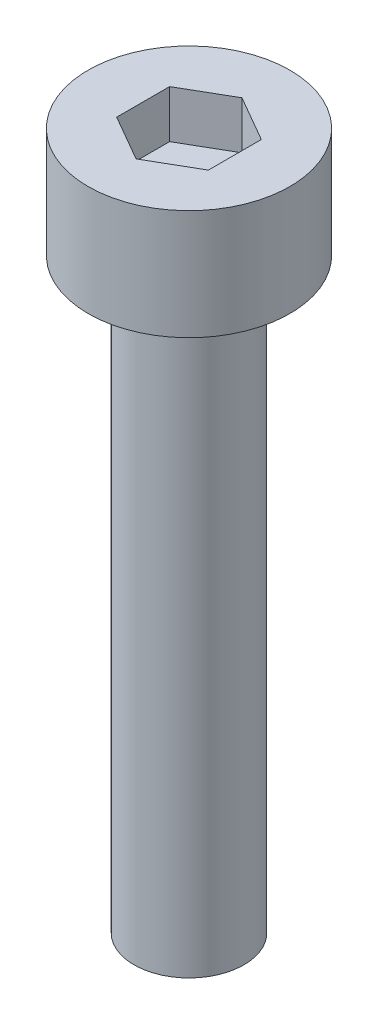
ISO-10303-21;
HEADER;
FILE_DESCRIPTION(('STEP AP214'),'2;1');
FILE_NAME('part.step','',(''),(''),'','','');
FILE_SCHEMA(('AUTOMOTIVE_DESIGN { 1 0 10303 214 1 1 1 1 }'));
ENDSEC;
DATA;
#1=APPLICATION_CONTEXT('core data for automotive mechanical design processes');
#2=APPLICATION_PROTOCOL_DEFINITION('international standard','automotive_design',2000,#1);
#3=PRODUCT_CONTEXT('',#1,'mechanical');
#4=PRODUCT('Part','Part','',(#3));
#5=PRODUCT_RELATED_PRODUCT_CATEGORY('part','',(#4));
#6=PRODUCT_DEFINITION_FORMATION('','',#4);
#7=PRODUCT_DEFINITION_CONTEXT('part definition',#1,'design');
#8=PRODUCT_DEFINITION('design','',#6,#7);
#9=PRODUCT_DEFINITION_SHAPE('','',#8);
#10=(LENGTH_UNIT() NAMED_UNIT(*) SI_UNIT(.MILLI.,.METRE.));
#11=(NAMED_UNIT(*) PLANE_ANGLE_UNIT() SI_UNIT($,.RADIAN.));
#12=(NAMED_UNIT(*) SI_UNIT($,.STERADIAN.) SOLID_ANGLE_UNIT());
#13=UNCERTAINTY_MEASURE_WITH_UNIT(LENGTH_MEASURE(1.E-05),#10,'distance_accuracy_value','');
#14=(GEOMETRIC_REPRESENTATION_CONTEXT(3) GLOBAL_UNCERTAINTY_ASSIGNED_CONTEXT((#13)) GLOBAL_UNIT_ASSIGNED_CONTEXT((#10,
#11,#12)) REPRESENTATION_CONTEXT('',''));
#15=CARTESIAN_POINT('',(0.,0.,0.));
#16=DIRECTION('',(0.,0.,1.));
#17=DIRECTION('',(1.,0.,0.));
#18=AXIS2_PLACEMENT_3D('',#15,#16,#17);
#19=CARTESIAN_POINT('',(0.,3.,0.));
#20=DIRECTION('',(0.,-1.,0.));
#21=DIRECTION('',(0.,0.,-1.));
#22=AXIS2_PLACEMENT_3D('',#19,#20,#21);
#23=CYLINDRICAL_SURFACE('',#22,2.75);
#24=CARTESIAN_POINT('',(0.,3.,0.));
#25=DIRECTION('',(0.,1.,0.));
#26=DIRECTION('',(0.,0.,1.));
#27=AXIS2_PLACEMENT_3D('',#24,#25,#26);
#28=CIRCLE('',#27,2.75);
#29=CARTESIAN_POINT('',(0.,3.,2.75));
#30=VERTEX_POINT('',#29);
#31=EDGE_CURVE('E44',#30,#30,#28,.T.);
#32=ORIENTED_EDGE('',*,*,#31,.F.);
#33=EDGE_LOOP('',(#32));
#34=FACE_BOUND('',#33,.T.);
#35=CARTESIAN_POINT('',(0.,0.,0.));
#36=DIRECTION('',(0.,1.,0.));
#37=DIRECTION('',(0.,0.,1.));
#38=AXIS2_PLACEMENT_3D('',#35,#36,#37);
#39=CIRCLE('',#38,2.75);
#40=CARTESIAN_POINT('',(0.,0.,2.75));
#41=VERTEX_POINT('',#40);
#42=EDGE_CURVE('E39',#41,#41,#39,.T.);
#43=ORIENTED_EDGE('',*,*,#42,.T.);
#44=EDGE_LOOP('',(#43));
#45=FACE_BOUND('',#44,.T.);
#46=ADVANCED_FACE('F36',(#34,#45),#23,.T.);
#47=CARTESIAN_POINT('',(0.,3.,0.));
#48=DIRECTION('',(0.,1.,0.));
#49=DIRECTION('',(0.,0.,1.));
#50=AXIS2_PLACEMENT_3D('',#47,#48,#49);
#51=PLANE('',#50);
#52=DIRECTION('',(-0.866025403784439,0.,-0.5));
#53=VECTOR('',#52,1.);
#54=CARTESIAN_POINT('',(1.25,3.,-0.721687836487033));
#55=LINE('',#54,#53);
#56=CARTESIAN_POINT('',(1.25,3.,-0.721687836487033));
#57=VERTEX_POINT('',#56);
#58=CARTESIAN_POINT('',(0.,3.,-1.44337567297407));
#59=VERTEX_POINT('',#58);
#60=EDGE_CURVE('E52',#57,#59,#55,.T.);
#61=ORIENTED_EDGE('',*,*,#60,.F.);
#62=DIRECTION('',(0.,0.,-1.));
#63=VECTOR('',#62,1.);
#64=CARTESIAN_POINT('',(1.25,3.,0.721687836487033));
#65=LINE('',#64,#63);
#66=CARTESIAN_POINT('',(1.25,3.,0.721687836487033));
#67=VERTEX_POINT('',#66);
#68=EDGE_CURVE('E136',#67,#57,#65,.T.);
#69=ORIENTED_EDGE('',*,*,#68,.F.);
#70=DIRECTION('',(0.866025403784439,0.,-0.5));
#71=VECTOR('',#70,1.);
#72=CARTESIAN_POINT('',(0.,3.,1.44337567297406));
#73=LINE('',#72,#71);
#74=CARTESIAN_POINT('',(0.,3.,1.44337567297406));
#75=VERTEX_POINT('',#74);
#76=EDGE_CURVE('E134',#75,#67,#73,.T.);
#77=ORIENTED_EDGE('',*,*,#76,.F.);
#78=DIRECTION('',(0.866025403784439,0.,0.5));
#79=VECTOR('',#78,1.);
#80=CARTESIAN_POINT('',(-1.25,3.,0.721687836487032));
#81=LINE('',#80,#79);
#82=CARTESIAN_POINT('',(-1.25,3.,0.721687836487032));
#83=VERTEX_POINT('',#82);
#84=EDGE_CURVE('E100',#83,#75,#81,.T.);
#85=ORIENTED_EDGE('',*,*,#84,.F.);
#86=DIRECTION('',(0.,0.,1.));
#87=VECTOR('',#86,1.);
#88=CARTESIAN_POINT('',(-1.25,3.,-0.721687836487033));
#89=LINE('',#88,#87);
#90=CARTESIAN_POINT('',(-1.25,3.,-0.721687836487033));
#91=VERTEX_POINT('',#90);
#92=EDGE_CURVE('E130',#91,#83,#89,.T.);
#93=ORIENTED_EDGE('',*,*,#92,.F.);
#94=DIRECTION('',(-0.866025403784439,0.,0.5));
#95=VECTOR('',#94,1.);
#96=CARTESIAN_POINT('',(0.,3.,-1.44337567297407));
#97=LINE('',#96,#95);
#98=EDGE_CURVE('E126',#59,#91,#97,.T.);
#99=ORIENTED_EDGE('',*,*,#98,.F.);
#100=EDGE_LOOP('',(#61,#69,#77,#85,#93,#99));
#101=FACE_BOUND('',#100,.T.);
#102=ORIENTED_EDGE('',*,*,#31,.T.);
#103=EDGE_LOOP('',(#102));
#104=FACE_BOUND('',#103,.T.);
#105=ADVANCED_FACE('F154',(#101,#104),#51,.T.);
#106=CARTESIAN_POINT('',(0.,0.,0.));
#107=DIRECTION('',(0.,1.,0.));
#108=DIRECTION('',(0.,0.,1.));
#109=AXIS2_PLACEMENT_3D('',#106,#107,#108);
#110=PLANE('',#109);
#111=CARTESIAN_POINT('',(0.,0.,0.));
#112=DIRECTION('',(0.,-1.,0.));
#113=DIRECTION('',(0.,0.,-1.));
#114=AXIS2_PLACEMENT_3D('',#111,#112,#113);
#115=CIRCLE('',#114,1.5);
#116=CARTESIAN_POINT('',(0.,0.,-1.5));
#117=VERTEX_POINT('',#116);
#118=EDGE_CURVE('E11',#117,#117,#115,.T.);
#119=ORIENTED_EDGE('',*,*,#118,.F.);
#120=EDGE_LOOP('',(#119));
#121=FACE_BOUND('',#120,.T.);
#122=ORIENTED_EDGE('',*,*,#42,.F.);
#123=EDGE_LOOP('',(#122));
#124=FACE_BOUND('',#123,.T.);
#125=ADVANCED_FACE('F151',(#121,#124),#110,.F.);
#126=CARTESIAN_POINT('',(1.25,1.7,-0.721687836487033));
#127=DIRECTION('',(0.5,0.,-0.866025403784439));
#128=DIRECTION('',(-0.866025403784439,0.,-0.5));
#129=AXIS2_PLACEMENT_3D('',#126,#127,#128);
#130=PLANE('',#129);
#131=ORIENTED_EDGE('',*,*,#60,.T.);
#132=DIRECTION('',(0.,1.,0.));
#133=VECTOR('',#132,1.);
#134=CARTESIAN_POINT('',(0.,1.7,-1.44337567297407));
#135=LINE('',#134,#133);
#136=CARTESIAN_POINT('',(0.,1.7,-1.44337567297407));
#137=VERTEX_POINT('',#136);
#138=EDGE_CURVE('E82',#137,#59,#135,.T.);
#139=ORIENTED_EDGE('',*,*,#138,.F.);
#140=DIRECTION('',(-0.866025403784439,0.,-0.5));
#141=VECTOR('',#140,1.);
#142=CARTESIAN_POINT('',(1.25,1.7,-0.721687836487033));
#143=LINE('',#142,#141);
#144=CARTESIAN_POINT('',(1.25,1.7,-0.721687836487033));
#145=VERTEX_POINT('',#144);
#146=EDGE_CURVE('E138',#145,#137,#143,.T.);
#147=ORIENTED_EDGE('',*,*,#146,.F.);
#148=DIRECTION('',(0.,1.,0.));
#149=VECTOR('',#148,1.);
#150=CARTESIAN_POINT('',(1.25,1.7,-0.721687836487033));
#151=LINE('',#150,#149);
#152=EDGE_CURVE('E60',#145,#57,#151,.T.);
#153=ORIENTED_EDGE('',*,*,#152,.T.);
#154=EDGE_LOOP('',(#131,#139,#147,#153));
#155=FACE_BOUND('',#154,.T.);
#156=ADVANCED_FACE('F153',(#155),#130,.F.);
#157=CARTESIAN_POINT('',(1.25,1.7,0.721687836487033));
#158=DIRECTION('',(1.,0.,0.));
#159=DIRECTION('',(0.,0.,-1.));
#160=AXIS2_PLACEMENT_3D('',#157,#158,#159);
#161=PLANE('',#160);
#162=ORIENTED_EDGE('',*,*,#68,.T.);
#163=ORIENTED_EDGE('',*,*,#152,.F.);
#164=DIRECTION('',(0.,0.,-1.));
#165=VECTOR('',#164,1.);
#166=CARTESIAN_POINT('',(1.25,1.7,0.721687836487033));
#167=LINE('',#166,#165);
#168=CARTESIAN_POINT('',(1.25,1.7,0.721687836487033));
#169=VERTEX_POINT('',#168);
#170=EDGE_CURVE('E112',#169,#145,#167,.T.);
#171=ORIENTED_EDGE('',*,*,#170,.F.);
#172=DIRECTION('',(0.,1.,0.));
#173=VECTOR('',#172,1.);
#174=CARTESIAN_POINT('',(1.25,1.7,0.721687836487033));
#175=LINE('',#174,#173);
#176=EDGE_CURVE('E104',#169,#67,#175,.T.);
#177=ORIENTED_EDGE('',*,*,#176,.T.);
#178=EDGE_LOOP('',(#162,#163,#171,#177));
#179=FACE_BOUND('',#178,.T.);
#180=ADVANCED_FACE('F160',(#179),#161,.F.);
#181=CARTESIAN_POINT('',(0.,1.7,1.44337567297406));
#182=DIRECTION('',(0.5,0.,0.866025403784439));
#183=DIRECTION('',(0.866025403784439,0.,-0.5));
#184=AXIS2_PLACEMENT_3D('',#181,#182,#183);
#185=PLANE('',#184);
#186=ORIENTED_EDGE('',*,*,#76,.T.);
#187=ORIENTED_EDGE('',*,*,#176,.F.);
#188=DIRECTION('',(0.866025403784439,0.,-0.5));
#189=VECTOR('',#188,1.);
#190=CARTESIAN_POINT('',(0.,1.7,1.44337567297406));
#191=LINE('',#190,#189);
#192=CARTESIAN_POINT('',(0.,1.7,1.44337567297406));
#193=VERTEX_POINT('',#192);
#194=EDGE_CURVE('E108',#193,#169,#191,.T.);
#195=ORIENTED_EDGE('',*,*,#194,.F.);
#196=DIRECTION('',(0.,1.,0.));
#197=VECTOR('',#196,1.);
#198=CARTESIAN_POINT('',(0.,1.7,1.44337567297406));
#199=LINE('',#198,#197);
#200=EDGE_CURVE('E93',#193,#75,#199,.T.);
#201=ORIENTED_EDGE('',*,*,#200,.T.);
#202=EDGE_LOOP('',(#186,#187,#195,#201));
#203=FACE_BOUND('',#202,.T.);
#204=ADVANCED_FACE('F109',(#203),#185,.F.);
#205=CARTESIAN_POINT('',(-1.25,1.7,0.721687836487032));
#206=DIRECTION('',(-0.5,0.,0.866025403784439));
#207=DIRECTION('',(0.866025403784439,0.,0.5));
#208=AXIS2_PLACEMENT_3D('',#205,#206,#207);
#209=PLANE('',#208);
#210=ORIENTED_EDGE('',*,*,#84,.T.);
#211=ORIENTED_EDGE('',*,*,#200,.F.);
#212=DIRECTION('',(0.866025403784439,0.,0.5));
#213=VECTOR('',#212,1.);
#214=CARTESIAN_POINT('',(-1.25,1.7,0.721687836487032));
#215=LINE('',#214,#213);
#216=CARTESIAN_POINT('',(-1.25,1.7,0.721687836487032));
#217=VERTEX_POINT('',#216);
#218=EDGE_CURVE('E97',#217,#193,#215,.T.);
#219=ORIENTED_EDGE('',*,*,#218,.F.);
#220=DIRECTION('',(0.,1.,0.));
#221=VECTOR('',#220,1.);
#222=CARTESIAN_POINT('',(-1.25,1.7,0.721687836487032));
#223=LINE('',#222,#221);
#224=EDGE_CURVE('E105',#217,#83,#223,.T.);
#225=ORIENTED_EDGE('',*,*,#224,.T.);
#226=EDGE_LOOP('',(#210,#211,#219,#225));
#227=FACE_BOUND('',#226,.T.);
#228=ADVANCED_FACE('F95',(#227),#209,.F.);
#229=CARTESIAN_POINT('',(-1.25,1.7,-0.721687836487033));
#230=DIRECTION('',(-1.,0.,0.));
#231=DIRECTION('',(0.,0.,1.));
#232=AXIS2_PLACEMENT_3D('',#229,#230,#231);
#233=PLANE('',#232);
#234=ORIENTED_EDGE('',*,*,#92,.T.);
#235=ORIENTED_EDGE('',*,*,#224,.F.);
#236=DIRECTION('',(0.,0.,1.));
#237=VECTOR('',#236,1.);
#238=CARTESIAN_POINT('',(-1.25,1.7,-0.721687836487033));
#239=LINE('',#238,#237);
#240=CARTESIAN_POINT('',(-1.25,1.7,-0.721687836487033));
#241=VERTEX_POINT('',#240);
#242=EDGE_CURVE('E118',#241,#217,#239,.T.);
#243=ORIENTED_EDGE('',*,*,#242,.F.);
#244=DIRECTION('',(0.,1.,0.));
#245=VECTOR('',#244,1.);
#246=CARTESIAN_POINT('',(-1.25,1.7,-0.721687836487033));
#247=LINE('',#246,#245);
#248=EDGE_CURVE('E142',#241,#91,#247,.T.);
#249=ORIENTED_EDGE('',*,*,#248,.T.);
#250=EDGE_LOOP('',(#234,#235,#243,#249));
#251=FACE_BOUND('',#250,.T.);
#252=ADVANCED_FACE('F205',(#251),#233,.F.);
#253=CARTESIAN_POINT('',(0.,1.7,-1.44337567297407));
#254=DIRECTION('',(-0.5,0.,-0.866025403784439));
#255=DIRECTION('',(-0.866025403784439,0.,0.5));
#256=AXIS2_PLACEMENT_3D('',#253,#254,#255);
#257=PLANE('',#256);
#258=ORIENTED_EDGE('',*,*,#98,.T.);
#259=ORIENTED_EDGE('',*,*,#248,.F.);
#260=DIRECTION('',(-0.866025403784439,0.,0.5));
#261=VECTOR('',#260,1.);
#262=CARTESIAN_POINT('',(0.,1.7,-1.44337567297407));
#263=LINE('',#262,#261);
#264=EDGE_CURVE('E120',#137,#241,#263,.T.);
#265=ORIENTED_EDGE('',*,*,#264,.F.);
#266=ORIENTED_EDGE('',*,*,#138,.T.);
#267=EDGE_LOOP('',(#258,#259,#265,#266));
#268=FACE_BOUND('',#267,.T.);
#269=ADVANCED_FACE('F214',(#268),#257,.F.);
#270=CARTESIAN_POINT('',(0.,1.7,0.));
#271=DIRECTION('',(0.,1.,0.));
#272=DIRECTION('',(0.,0.,1.));
#273=AXIS2_PLACEMENT_3D('',#270,#271,#272);
#274=PLANE('',#273);
#275=ORIENTED_EDGE('',*,*,#146,.T.);
#276=ORIENTED_EDGE('',*,*,#264,.T.);
#277=ORIENTED_EDGE('',*,*,#242,.T.);
#278=ORIENTED_EDGE('',*,*,#218,.T.);
#279=ORIENTED_EDGE('',*,*,#194,.T.);
#280=ORIENTED_EDGE('',*,*,#170,.T.);
#281=EDGE_LOOP('',(#275,#276,#277,#278,#279,#280));
#282=FACE_BOUND('',#281,.T.);
#283=ADVANCED_FACE('F115',(#282),#274,.T.);
#284=CARTESIAN_POINT('',(0.,-16.,0.));
#285=DIRECTION('',(0.,1.,0.));
#286=DIRECTION('',(0.,0.,1.));
#287=AXIS2_PLACEMENT_3D('',#284,#285,#286);
#288=CYLINDRICAL_SURFACE('',#287,1.5);
#289=CARTESIAN_POINT('',(0.,-16.,0.));
#290=DIRECTION('',(0.,-1.,0.));
#291=DIRECTION('',(0.,0.,-1.));
#292=AXIS2_PLACEMENT_3D('',#289,#290,#291);
#293=CIRCLE('',#292,1.5);
#294=CARTESIAN_POINT('',(0.,-16.,-1.5));
#295=VERTEX_POINT('',#294);
#296=EDGE_CURVE('E127',#295,#295,#293,.T.);
#297=ORIENTED_EDGE('',*,*,#296,.F.);
#298=EDGE_LOOP('',(#297));
#299=FACE_BOUND('',#298,.T.);
#300=ORIENTED_EDGE('',*,*,#118,.T.);
#301=EDGE_LOOP('',(#300));
#302=FACE_BOUND('',#301,.T.);
#303=ADVANCED_FACE('F232',(#299,#302),#288,.T.);
#304=CARTESIAN_POINT('',(0.,-16.,0.));
#305=DIRECTION('',(0.,-1.,0.));
#306=DIRECTION('',(0.,0.,-1.));
#307=AXIS2_PLACEMENT_3D('',#304,#305,#306);
#308=PLANE('',#307);
#309=ORIENTED_EDGE('',*,*,#296,.T.);
#310=EDGE_LOOP('',(#309));
#311=FACE_BOUND('',#310,.T.);
#312=ADVANCED_FACE('F245',(#311),#308,.T.);
#313=CLOSED_SHELL('',(#46,#105,#125,#156,#180,#204,#228,#252,#269,#283,#303,#312));
#314=MANIFOLD_SOLID_BREP('B2',#313);
#315=ADVANCED_BREP_SHAPE_REPRESENTATION('',(#18,#314),#14);
#316=SHAPE_DEFINITION_REPRESENTATION(#9,#315);
ENDSEC;
END-ISO-10303-21;
